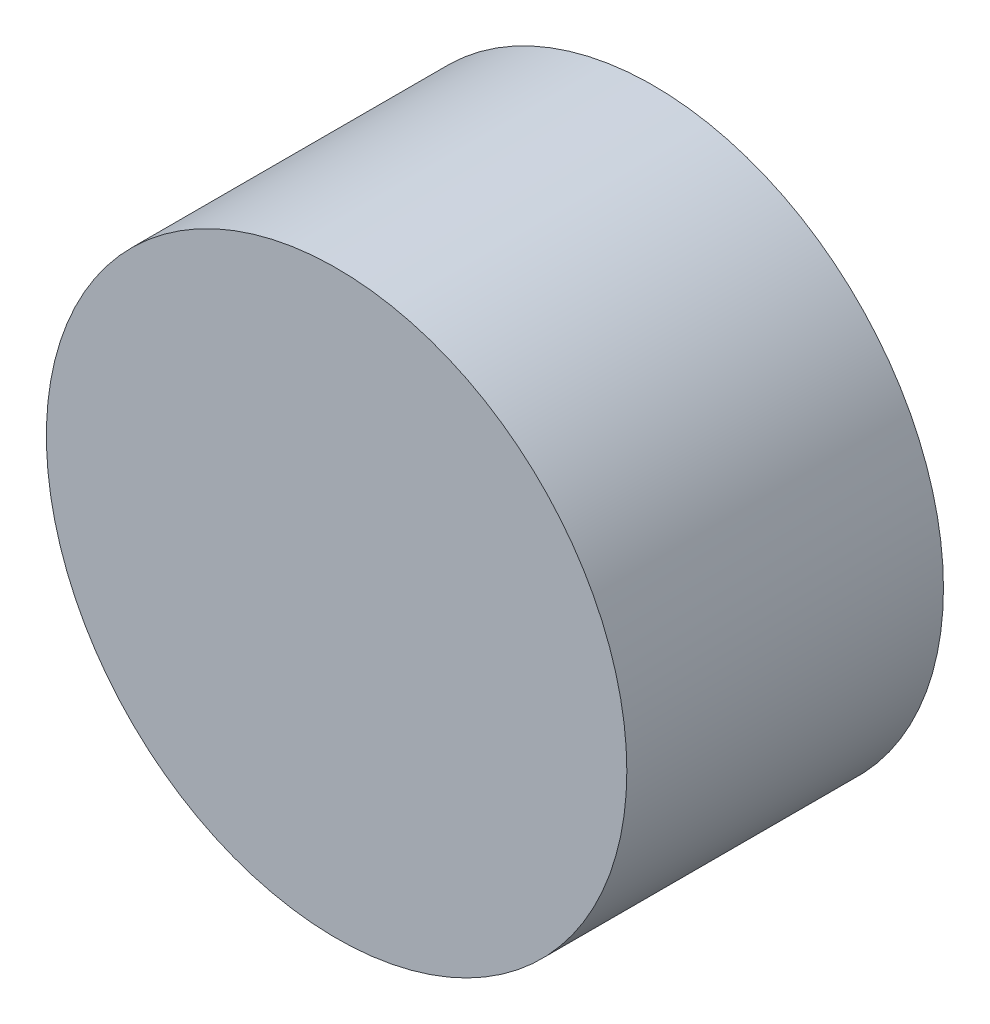
ISO-10303-21;
HEADER;
FILE_DESCRIPTION(('STEP AP214'),'2;1');
FILE_NAME('part.step','',(''),(''),'','','');
FILE_SCHEMA(('AUTOMOTIVE_DESIGN { 1 0 10303 214 1 1 1 1 }'));
ENDSEC;
DATA;
#1=APPLICATION_CONTEXT('core data for automotive mechanical design processes');
#2=APPLICATION_PROTOCOL_DEFINITION('international standard','automotive_design',2000,#1);
#3=PRODUCT_CONTEXT('',#1,'mechanical');
#4=PRODUCT('Part','Part','',(#3));
#5=PRODUCT_RELATED_PRODUCT_CATEGORY('part','',(#4));
#6=PRODUCT_DEFINITION_FORMATION('','',#4);
#7=PRODUCT_DEFINITION_CONTEXT('part definition',#1,'design');
#8=PRODUCT_DEFINITION('design','',#6,#7);
#9=PRODUCT_DEFINITION_SHAPE('','',#8);
#10=(LENGTH_UNIT() NAMED_UNIT(*) SI_UNIT(.MILLI.,.METRE.));
#11=(NAMED_UNIT(*) PLANE_ANGLE_UNIT() SI_UNIT($,.RADIAN.));
#12=(NAMED_UNIT(*) SI_UNIT($,.STERADIAN.) SOLID_ANGLE_UNIT());
#13=UNCERTAINTY_MEASURE_WITH_UNIT(LENGTH_MEASURE(1.E-05),#10,'distance_accuracy_value','');
#14=(GEOMETRIC_REPRESENTATION_CONTEXT(3) GLOBAL_UNCERTAINTY_ASSIGNED_CONTEXT((#13)) GLOBAL_UNIT_ASSIGNED_CONTEXT((#10,
#11,#12)) REPRESENTATION_CONTEXT('',''));
#15=CARTESIAN_POINT('',(0.,0.,0.));
#16=DIRECTION('',(0.,0.,1.));
#17=DIRECTION('',(1.,0.,0.));
#18=AXIS2_PLACEMENT_3D('',#15,#16,#17);
#19=CARTESIAN_POINT('',(0.,0.,3.));
#20=DIRECTION('',(0.,0.,-1.));
#21=DIRECTION('',(-1.,0.,0.));
#22=AXIS2_PLACEMENT_3D('',#19,#20,#21);
#23=CYLINDRICAL_SURFACE('',#22,2.75);
#24=CARTESIAN_POINT('',(0.,0.,3.));
#25=DIRECTION('',(0.,0.,1.));
#26=DIRECTION('',(1.,0.,0.));
#27=AXIS2_PLACEMENT_3D('',#24,#25,#26);
#28=CIRCLE('',#27,2.75);
#29=CARTESIAN_POINT('',(2.75,0.,3.));
#30=VERTEX_POINT('',#29);
#31=EDGE_CURVE('E10',#30,#30,#28,.T.);
#32=ORIENTED_EDGE('',*,*,#31,.F.);
#33=EDGE_LOOP('',(#32));
#34=FACE_BOUND('',#33,.T.);
#35=CARTESIAN_POINT('',(0.,0.,0.));
#36=DIRECTION('',(0.,0.,1.));
#37=DIRECTION('',(1.,0.,0.));
#38=AXIS2_PLACEMENT_3D('',#35,#36,#37);
#39=CIRCLE('',#38,2.75);
#40=CARTESIAN_POINT('',(2.75,0.,0.));
#41=VERTEX_POINT('',#40);
#42=EDGE_CURVE('E38',#41,#41,#39,.T.);
#43=ORIENTED_EDGE('',*,*,#42,.T.);
#44=EDGE_LOOP('',(#43));
#45=FACE_BOUND('',#44,.T.);
#46=ADVANCED_FACE('F35',(#34,#45),#23,.T.);
#47=CARTESIAN_POINT('',(0.,0.,3.));
#48=DIRECTION('',(0.,0.,1.));
#49=DIRECTION('',(1.,0.,0.));
#50=AXIS2_PLACEMENT_3D('',#47,#48,#49);
#51=PLANE('',#50);
#52=ORIENTED_EDGE('',*,*,#31,.T.);
#53=EDGE_LOOP('',(#52));
#54=FACE_BOUND('',#53,.T.);
#55=ADVANCED_FACE('F50',(#54),#51,.T.);
#56=CARTESIAN_POINT('',(0.,0.,0.));
#57=DIRECTION('',(0.,0.,1.));
#58=DIRECTION('',(1.,0.,0.));
#59=AXIS2_PLACEMENT_3D('',#56,#57,#58);
#60=PLANE('',#59);
#61=ORIENTED_EDGE('',*,*,#42,.F.);
#62=EDGE_LOOP('',(#61));
#63=FACE_BOUND('',#62,.T.);
#64=ADVANCED_FACE('F48',(#63),#60,.F.);
#65=CLOSED_SHELL('',(#46,#55,#64));
#66=MANIFOLD_SOLID_BREP('B2',#65);
#67=ADVANCED_BREP_SHAPE_REPRESENTATION('',(#18,#66),#14);
#68=SHAPE_DEFINITION_REPRESENTATION(#9,#67);
ENDSEC;
END-ISO-10303-21;
